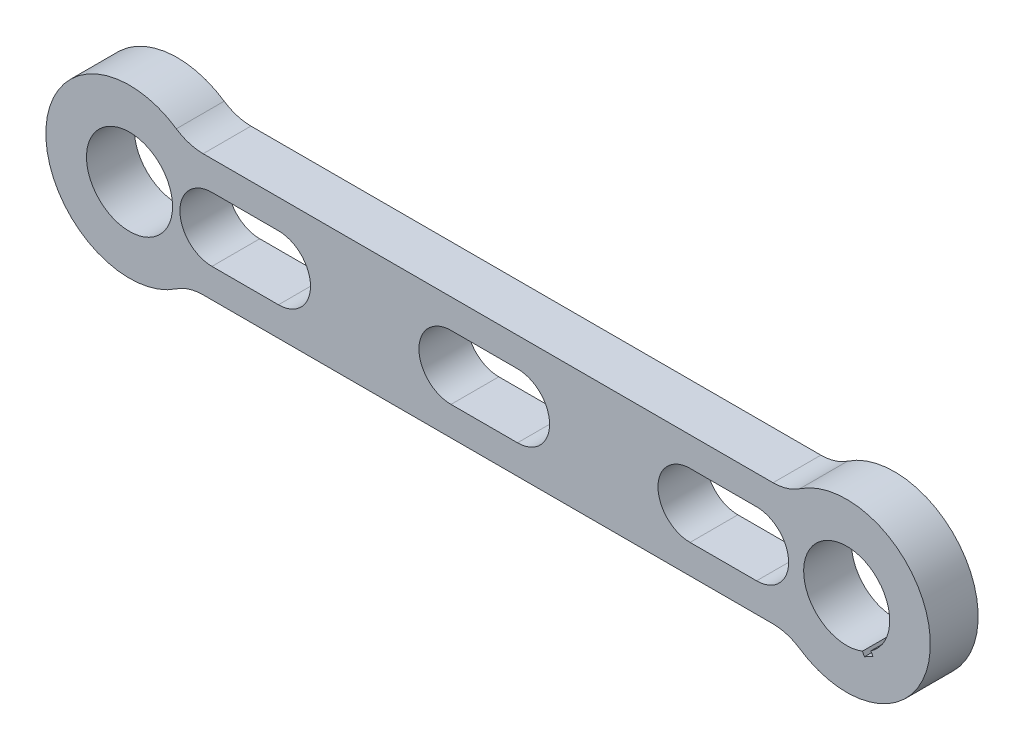
ISO-10303-21;
HEADER;
FILE_DESCRIPTION(('STEP AP214'),'2;1');
FILE_NAME('part.step','',(''),(''),'','','');
FILE_SCHEMA(('AUTOMOTIVE_DESIGN { 1 0 10303 214 1 1 1 1 }'));
ENDSEC;
DATA;
#1=APPLICATION_CONTEXT('core data for automotive mechanical design processes');
#2=APPLICATION_PROTOCOL_DEFINITION('international standard','automotive_design',2000,#1);
#3=PRODUCT_CONTEXT('',#1,'mechanical');
#4=PRODUCT('Part','Part','',(#3));
#5=PRODUCT_RELATED_PRODUCT_CATEGORY('part','',(#4));
#6=PRODUCT_DEFINITION_FORMATION('','',#4);
#7=PRODUCT_DEFINITION_CONTEXT('part definition',#1,'design');
#8=PRODUCT_DEFINITION('design','',#6,#7);
#9=PRODUCT_DEFINITION_SHAPE('','',#8);
#10=(LENGTH_UNIT() NAMED_UNIT(*) SI_UNIT(.MILLI.,.METRE.));
#11=(NAMED_UNIT(*) PLANE_ANGLE_UNIT() SI_UNIT($,.RADIAN.));
#12=(NAMED_UNIT(*) SI_UNIT($,.STERADIAN.) SOLID_ANGLE_UNIT());
#13=UNCERTAINTY_MEASURE_WITH_UNIT(LENGTH_MEASURE(1.E-05),#10,'distance_accuracy_value','');
#14=(GEOMETRIC_REPRESENTATION_CONTEXT(3) GLOBAL_UNCERTAINTY_ASSIGNED_CONTEXT((#13)) GLOBAL_UNIT_ASSIGNED_CONTEXT((#10,
#11,#12)) REPRESENTATION_CONTEXT('',''));
#15=CARTESIAN_POINT('',(0.,0.,0.));
#16=DIRECTION('',(0.,0.,1.));
#17=DIRECTION('',(1.,0.,0.));
#18=AXIS2_PLACEMENT_3D('',#15,#16,#17);
#19=CARTESIAN_POINT('',(79.3446729165543,0.,10.));
#20=DIRECTION('',(0.,0.,1.));
#21=DIRECTION('',(1.,0.,0.));
#22=AXIS2_PLACEMENT_3D('',#19,#20,#21);
#23=PLANE('',#22);
#24=DIRECTION('',(-0.467487187933383,0.883999846786264,0.));
#25=VECTOR('',#24,1.);
#26=CARTESIAN_POINT('',(84.835179051889,-8.24323458145261,10.));
#27=LINE('',#26,#25);
#28=CARTESIAN_POINT('',(84.835179051889,-8.24323458145261,10.));
#29=VERTEX_POINT('',#28);
#30=CARTESIAN_POINT('',(84.4100053103257,-7.43924779400506,10.));
#31=VERTEX_POINT('',#30);
#32=EDGE_CURVE('E226',#29,#31,#27,.T.);
#33=ORIENTED_EDGE('',*,*,#32,.F.);
#34=DIRECTION('',(0.883999846786263,0.467487187933384,0.));
#35=VECTOR('',#34,1.);
#36=CARTESIAN_POINT('',(84.835179051889,-8.24323458145261,10.));
#37=LINE('',#36,#35);
#38=CARTESIAN_POINT('',(83.0671793583165,-9.17820895731938,10.));
#39=VERTEX_POINT('',#38);
#40=EDGE_CURVE('E228',#39,#29,#37,.T.);
#41=ORIENTED_EDGE('',*,*,#40,.F.);
#42=DIRECTION('',(0.467487187933383,-0.883999846786264,0.));
#43=VECTOR('',#42,1.);
#44=CARTESIAN_POINT('',(82.6258447912271,-8.34366268576654,10.));
#45=LINE('',#44,#43);
#46=CARTESIAN_POINT('',(82.6420056197279,-8.37422217549676,10.));
#47=VERTEX_POINT('',#46);
#48=EDGE_CURVE('E207',#47,#39,#45,.T.);
#49=ORIENTED_EDGE('',*,*,#48,.F.);
#50=CARTESIAN_POINT('',(79.3446729165543,0.,10.));
#51=DIRECTION('',(0.,0.,1.));
#52=DIRECTION('',(1.,0.,0.));
#53=AXIS2_PLACEMENT_3D('',#50,#51,#52);
#54=CIRCLE('',#53,9.);
#55=EDGE_CURVE('E328',#31,#47,#54,.T.);
#56=ORIENTED_EDGE('',*,*,#55,.F.);
#57=EDGE_LOOP('',(#33,#41,#49,#56));
#58=FACE_BOUND('',#57,.T.);
#59=CARTESIAN_POINT('',(-70.6553270834457,0.,10.));
#60=DIRECTION('',(0.,0.,1.));
#61=DIRECTION('',(1.,0.,0.));
#62=AXIS2_PLACEMENT_3D('',#59,#60,#61);
#63=CIRCLE('',#62,9.);
#64=CARTESIAN_POINT('',(-61.6553270834457,0.,10.));
#65=VERTEX_POINT('',#64);
#66=EDGE_CURVE('E333',#65,#65,#63,.T.);
#67=ORIENTED_EDGE('',*,*,#66,.F.);
#68=EDGE_LOOP('',(#67));
#69=FACE_BOUND('',#68,.T.);
#70=DIRECTION('',(1.,0.,0.));
#71=VECTOR('',#70,1.);
#72=CARTESIAN_POINT('',(-58.704034485948,-12.7834504437963,10.));
#73=LINE('',#72,#71);
#74=CARTESIAN_POINT('',(-55.2551846855626,-12.7834504437963,10.));
#75=VERTEX_POINT('',#74);
#76=CARTESIAN_POINT('',(63.9445305186712,-12.7834504437963,10.));
#77=VERTEX_POINT('',#76);
#78=EDGE_CURVE('E348',#75,#77,#73,.T.);
#79=ORIENTED_EDGE('',*,*,#78,.T.);
#80=CARTESIAN_POINT('',(63.9445305186712,-22.7834504437963,10.));
#81=DIRECTION('',(0.,0.,1.));
#82=DIRECTION('',(1.,0.,0.));
#83=AXIS2_PLACEMENT_3D('',#80,#81,#82);
#84=CIRCLE('',#83,10.);
#85=CARTESIAN_POINT('',(69.5445822997196,-14.4985593733249,10.));
#86=VERTEX_POINT('',#85);
#87=EDGE_CURVE('E385',#77,#86,#84,.F.);
#88=ORIENTED_EDGE('',*,*,#87,.T.);
#89=CARTESIAN_POINT('',(79.3446729165543,0.,10.));
#90=DIRECTION('',(0.,0.,1.));
#91=DIRECTION('',(1.,0.,0.));
#92=AXIS2_PLACEMENT_3D('',#89,#90,#91);
#93=CIRCLE('',#92,17.5);
#94=CARTESIAN_POINT('',(69.5445822997196,14.4985593733249,10.));
#95=VERTEX_POINT('',#94);
#96=EDGE_CURVE('E339',#86,#95,#93,.T.);
#97=ORIENTED_EDGE('',*,*,#96,.T.);
#98=CARTESIAN_POINT('',(63.9445305186712,22.7834504437963,10.));
#99=DIRECTION('',(0.,0.,1.));
#100=DIRECTION('',(1.,0.,0.));
#101=AXIS2_PLACEMENT_3D('',#98,#99,#100);
#102=CIRCLE('',#101,10.);
#103=CARTESIAN_POINT('',(63.9445305186712,12.7834504437963,10.));
#104=VERTEX_POINT('',#103);
#105=EDGE_CURVE('E381',#95,#104,#102,.F.);
#106=ORIENTED_EDGE('',*,*,#105,.T.);
#107=DIRECTION('',(-1.,0.,0.));
#108=VECTOR('',#107,1.);
#109=CARTESIAN_POINT('',(-58.704034485948,12.7834504437963,10.));
#110=LINE('',#109,#108);
#111=CARTESIAN_POINT('',(-55.2551846855626,12.7834504437963,10.));
#112=VERTEX_POINT('',#111);
#113=EDGE_CURVE('E342',#104,#112,#110,.T.);
#114=ORIENTED_EDGE('',*,*,#113,.T.);
#115=CARTESIAN_POINT('',(-55.2551846855626,22.7834504437963,10.));
#116=DIRECTION('',(0.,0.,1.));
#117=DIRECTION('',(1.,0.,0.));
#118=AXIS2_PLACEMENT_3D('',#115,#116,#117);
#119=CIRCLE('',#118,10.);
#120=CARTESIAN_POINT('',(-60.855236466611,14.4985593733249,10.));
#121=VERTEX_POINT('',#120);
#122=EDGE_CURVE('E393',#112,#121,#119,.F.);
#123=ORIENTED_EDGE('',*,*,#122,.T.);
#124=CARTESIAN_POINT('',(-70.6553270834457,0.,10.));
#125=DIRECTION('',(0.,0.,1.));
#126=DIRECTION('',(1.,0.,0.));
#127=AXIS2_PLACEMENT_3D('',#124,#125,#126);
#128=CIRCLE('',#127,17.5);
#129=CARTESIAN_POINT('',(-60.855236466611,-14.4985593733249,10.));
#130=VERTEX_POINT('',#129);
#131=EDGE_CURVE('E346',#121,#130,#128,.T.);
#132=ORIENTED_EDGE('',*,*,#131,.T.);
#133=CARTESIAN_POINT('',(-55.2551846855626,-22.7834504437963,10.));
#134=DIRECTION('',(0.,0.,1.));
#135=DIRECTION('',(1.,0.,0.));
#136=AXIS2_PLACEMENT_3D('',#133,#134,#135);
#137=CIRCLE('',#136,10.);
#138=EDGE_CURVE('E389',#130,#75,#137,.F.);
#139=ORIENTED_EDGE('',*,*,#138,.T.);
#140=EDGE_LOOP('',(#79,#88,#97,#106,#114,#123,#132,#139));
#141=FACE_BOUND('',#140,.T.);
#142=DIRECTION('',(1.,0.,0.));
#143=VECTOR('',#142,1.);
#144=CARTESIAN_POINT('',(-53.4129788387876,-6.70241567098039,10.));
#145=LINE('',#144,#143);
#146=CARTESIAN_POINT('',(-53.4129788387876,-6.70241567098039,10.));
#147=VERTEX_POINT('',#146);
#148=CARTESIAN_POINT('',(-39.5013970371676,-6.70241567098039,10.));
#149=VERTEX_POINT('',#148);
#150=EDGE_CURVE('E300',#147,#149,#145,.T.);
#151=ORIENTED_EDGE('',*,*,#150,.F.);
#152=CARTESIAN_POINT('',(-53.4129788387876,0.,10.));
#153=DIRECTION('',(0.,0.,1.));
#154=DIRECTION('',(1.,0.,0.));
#155=AXIS2_PLACEMENT_3D('',#152,#153,#154);
#156=CIRCLE('',#155,6.70241567098039);
#157=CARTESIAN_POINT('',(-53.4129788387876,6.70241567098039,10.));
#158=VERTEX_POINT('',#157);
#159=EDGE_CURVE('E298',#158,#147,#156,.T.);
#160=ORIENTED_EDGE('',*,*,#159,.F.);
#161=DIRECTION('',(-1.,0.,0.));
#162=VECTOR('',#161,1.);
#163=CARTESIAN_POINT('',(-53.4129788387876,6.70241567098039,10.));
#164=LINE('',#163,#162);
#165=CARTESIAN_POINT('',(-39.5013970371676,6.70241567098039,10.));
#166=VERTEX_POINT('',#165);
#167=EDGE_CURVE('E306',#166,#158,#164,.T.);
#168=ORIENTED_EDGE('',*,*,#167,.F.);
#169=CARTESIAN_POINT('',(-39.5013970371676,0.,10.));
#170=DIRECTION('',(0.,0.,1.));
#171=DIRECTION('',(1.,0.,0.));
#172=AXIS2_PLACEMENT_3D('',#169,#170,#171);
#173=CIRCLE('',#172,6.70241567098039);
#174=EDGE_CURVE('E303',#149,#166,#173,.T.);
#175=ORIENTED_EDGE('',*,*,#174,.F.);
#176=EDGE_LOOP('',(#151,#160,#168,#175));
#177=FACE_BOUND('',#176,.T.);
#178=DIRECTION('',(1.,0.,0.));
#179=VECTOR('',#178,1.);
#180=CARTESIAN_POINT('',(-3.41297883878763,-6.7024156709804,10.));
#181=LINE('',#180,#179);
#182=CARTESIAN_POINT('',(-3.41297883878763,-6.7024156709804,10.));
#183=VERTEX_POINT('',#182);
#184=CARTESIAN_POINT('',(10.4986029628324,-6.7024156709804,10.));
#185=VERTEX_POINT('',#184);
#186=EDGE_CURVE('E269',#183,#185,#181,.T.);
#187=ORIENTED_EDGE('',*,*,#186,.F.);
#188=CARTESIAN_POINT('',(-3.41297883878763,0.,10.));
#189=DIRECTION('',(0.,0.,1.));
#190=DIRECTION('',(1.,0.,0.));
#191=AXIS2_PLACEMENT_3D('',#188,#189,#190);
#192=CIRCLE('',#191,6.7024156709804);
#193=CARTESIAN_POINT('',(-3.41297883878763,6.7024156709804,10.));
#194=VERTEX_POINT('',#193);
#195=EDGE_CURVE('E267',#194,#183,#192,.T.);
#196=ORIENTED_EDGE('',*,*,#195,.F.);
#197=DIRECTION('',(-1.,0.,0.));
#198=VECTOR('',#197,1.);
#199=CARTESIAN_POINT('',(-3.41297883878763,6.7024156709804,10.));
#200=LINE('',#199,#198);
#201=CARTESIAN_POINT('',(10.4986029628324,6.7024156709804,10.));
#202=VERTEX_POINT('',#201);
#203=EDGE_CURVE('E275',#202,#194,#200,.T.);
#204=ORIENTED_EDGE('',*,*,#203,.F.);
#205=CARTESIAN_POINT('',(10.4986029628324,0.,10.));
#206=DIRECTION('',(0.,0.,1.));
#207=DIRECTION('',(1.,0.,0.));
#208=AXIS2_PLACEMENT_3D('',#205,#206,#207);
#209=CIRCLE('',#208,6.7024156709804);
#210=EDGE_CURVE('E272',#185,#202,#209,.T.);
#211=ORIENTED_EDGE('',*,*,#210,.F.);
#212=EDGE_LOOP('',(#187,#196,#204,#211));
#213=FACE_BOUND('',#212,.T.);
#214=DIRECTION('',(1.,0.,0.));
#215=VECTOR('',#214,1.);
#216=CARTESIAN_POINT('',(46.5870211612124,-6.7024156709804,10.));
#217=LINE('',#216,#215);
#218=CARTESIAN_POINT('',(46.5870211612124,-6.7024156709804,10.));
#219=VERTEX_POINT('',#218);
#220=CARTESIAN_POINT('',(60.4986029628324,-6.7024156709804,10.));
#221=VERTEX_POINT('',#220);
#222=EDGE_CURVE('E238',#219,#221,#217,.T.);
#223=ORIENTED_EDGE('',*,*,#222,.F.);
#224=CARTESIAN_POINT('',(46.5870211612124,0.,10.));
#225=DIRECTION('',(0.,0.,1.));
#226=DIRECTION('',(1.,0.,0.));
#227=AXIS2_PLACEMENT_3D('',#224,#225,#226);
#228=CIRCLE('',#227,6.7024156709804);
#229=CARTESIAN_POINT('',(46.5870211612124,6.7024156709804,10.));
#230=VERTEX_POINT('',#229);
#231=EDGE_CURVE('E236',#230,#219,#228,.T.);
#232=ORIENTED_EDGE('',*,*,#231,.F.);
#233=DIRECTION('',(-1.,0.,0.));
#234=VECTOR('',#233,1.);
#235=CARTESIAN_POINT('',(46.5870211612124,6.7024156709804,10.));
#236=LINE('',#235,#234);
#237=CARTESIAN_POINT('',(60.4986029628324,6.7024156709804,10.));
#238=VERTEX_POINT('',#237);
#239=EDGE_CURVE('E244',#238,#230,#236,.T.);
#240=ORIENTED_EDGE('',*,*,#239,.F.);
#241=CARTESIAN_POINT('',(60.4986029628324,0.,10.));
#242=DIRECTION('',(0.,0.,1.));
#243=DIRECTION('',(1.,0.,0.));
#244=AXIS2_PLACEMENT_3D('',#241,#242,#243);
#245=CIRCLE('',#244,6.7024156709804);
#246=EDGE_CURVE('E241',#221,#238,#245,.T.);
#247=ORIENTED_EDGE('',*,*,#246,.F.);
#248=EDGE_LOOP('',(#223,#232,#240,#247));
#249=FACE_BOUND('',#248,.T.);
#250=ADVANCED_FACE('F43',(#58,#69,#141,#177,#213,#249),#23,.T.);
#251=CARTESIAN_POINT('',(79.3446729165543,0.,0.));
#252=DIRECTION('',(0.,0.,1.));
#253=DIRECTION('',(1.,0.,0.));
#254=AXIS2_PLACEMENT_3D('',#251,#252,#253);
#255=PLANE('',#254);
#256=CARTESIAN_POINT('',(-3.41297883878763,0.,0.));
#257=DIRECTION('',(0.,0.,1.));
#258=DIRECTION('',(1.,0.,0.));
#259=AXIS2_PLACEMENT_3D('',#256,#257,#258);
#260=CIRCLE('',#259,6.7024156709804);
#261=CARTESIAN_POINT('',(-3.41297883878762,6.7024156709804,0.));
#262=VERTEX_POINT('',#261);
#263=CARTESIAN_POINT('',(-3.41297883878763,-6.7024156709804,0.));
#264=VERTEX_POINT('',#263);
#265=EDGE_CURVE('E266',#262,#264,#260,.T.);
#266=ORIENTED_EDGE('',*,*,#265,.T.);
#267=DIRECTION('',(1.,0.,0.));
#268=VECTOR('',#267,1.);
#269=CARTESIAN_POINT('',(-3.41297883878763,-6.7024156709804,0.));
#270=LINE('',#269,#268);
#271=CARTESIAN_POINT('',(10.4986029628324,-6.7024156709804,0.));
#272=VERTEX_POINT('',#271);
#273=EDGE_CURVE('E280',#264,#272,#270,.T.);
#274=ORIENTED_EDGE('',*,*,#273,.T.);
#275=CARTESIAN_POINT('',(10.4986029628324,0.,0.));
#276=DIRECTION('',(0.,0.,1.));
#277=DIRECTION('',(1.,0.,0.));
#278=AXIS2_PLACEMENT_3D('',#275,#276,#277);
#279=CIRCLE('',#278,6.7024156709804);
#280=CARTESIAN_POINT('',(10.4986029628324,6.7024156709804,0.));
#281=VERTEX_POINT('',#280);
#282=EDGE_CURVE('E283',#272,#281,#279,.T.);
#283=ORIENTED_EDGE('',*,*,#282,.T.);
#284=DIRECTION('',(-1.,0.,0.));
#285=VECTOR('',#284,1.);
#286=CARTESIAN_POINT('',(-3.41297883878763,6.7024156709804,0.));
#287=LINE('',#286,#285);
#288=EDGE_CURVE('E270',#281,#262,#287,.T.);
#289=ORIENTED_EDGE('',*,*,#288,.T.);
#290=EDGE_LOOP('',(#266,#274,#283,#289));
#291=FACE_BOUND('',#290,.T.);
#292=DIRECTION('',(0.883999846786263,0.467487187933384,0.));
#293=VECTOR('',#292,1.);
#294=CARTESIAN_POINT('',(84.835179051889,-8.24323458145261,0.));
#295=LINE('',#294,#293);
#296=CARTESIAN_POINT('',(83.0671793583165,-9.17820895731938,0.));
#297=VERTEX_POINT('',#296);
#298=CARTESIAN_POINT('',(84.835179051889,-8.24323458145261,0.));
#299=VERTEX_POINT('',#298);
#300=EDGE_CURVE('E215',#297,#299,#295,.T.);
#301=ORIENTED_EDGE('',*,*,#300,.T.);
#302=DIRECTION('',(-0.467487187933383,0.883999846786264,0.));
#303=VECTOR('',#302,1.);
#304=CARTESIAN_POINT('',(84.835179051889,-8.24323458145261,0.));
#305=LINE('',#304,#303);
#306=CARTESIAN_POINT('',(84.4100053103257,-7.43924779400506,0.));
#307=VERTEX_POINT('',#306);
#308=EDGE_CURVE('E212',#299,#307,#305,.T.);
#309=ORIENTED_EDGE('',*,*,#308,.T.);
#310=CARTESIAN_POINT('',(79.3446729165543,0.,0.));
#311=DIRECTION('',(0.,0.,1.));
#312=DIRECTION('',(1.,0.,0.));
#313=AXIS2_PLACEMENT_3D('',#310,#311,#312);
#314=CIRCLE('',#313,9.);
#315=CARTESIAN_POINT('',(82.6420056197279,-8.37422217549677,0.));
#316=VERTEX_POINT('',#315);
#317=EDGE_CURVE('E225',#307,#316,#314,.T.);
#318=ORIENTED_EDGE('',*,*,#317,.T.);
#319=DIRECTION('',(0.467487187933383,-0.883999846786264,0.));
#320=VECTOR('',#319,1.);
#321=CARTESIAN_POINT('',(82.6258447912271,-8.34366268576654,0.));
#322=LINE('',#321,#320);
#323=EDGE_CURVE('E58',#316,#297,#322,.T.);
#324=ORIENTED_EDGE('',*,*,#323,.T.);
#325=EDGE_LOOP('',(#301,#309,#318,#324));
#326=FACE_BOUND('',#325,.T.);
#327=CARTESIAN_POINT('',(-70.6553270834457,0.,0.));
#328=DIRECTION('',(0.,0.,1.));
#329=DIRECTION('',(1.,0.,0.));
#330=AXIS2_PLACEMENT_3D('',#327,#328,#329);
#331=CIRCLE('',#330,9.);
#332=CARTESIAN_POINT('',(-61.6553270834457,0.,0.));
#333=VERTEX_POINT('',#332);
#334=EDGE_CURVE('E331',#333,#333,#331,.T.);
#335=ORIENTED_EDGE('',*,*,#334,.T.);
#336=EDGE_LOOP('',(#335));
#337=FACE_BOUND('',#336,.T.);
#338=CARTESIAN_POINT('',(79.3446729165543,0.,0.));
#339=DIRECTION('',(0.,0.,1.));
#340=DIRECTION('',(1.,0.,0.));
#341=AXIS2_PLACEMENT_3D('',#338,#339,#340);
#342=CIRCLE('',#341,17.5);
#343=CARTESIAN_POINT('',(69.5445822997196,-14.4985593733249,0.));
#344=VERTEX_POINT('',#343);
#345=CARTESIAN_POINT('',(69.5445822997196,14.4985593733249,0.));
#346=VERTEX_POINT('',#345);
#347=EDGE_CURVE('E336',#344,#346,#342,.T.);
#348=ORIENTED_EDGE('',*,*,#347,.F.);
#349=CARTESIAN_POINT('',(63.9445305186712,-22.7834504437963,0.));
#350=DIRECTION('',(0.,0.,1.));
#351=DIRECTION('',(1.,0.,0.));
#352=AXIS2_PLACEMENT_3D('',#349,#350,#351);
#353=CIRCLE('',#352,10.);
#354=CARTESIAN_POINT('',(63.9445305186712,-12.7834504437963,0.));
#355=VERTEX_POINT('',#354);
#356=EDGE_CURVE('E383',#344,#355,#353,.T.);
#357=ORIENTED_EDGE('',*,*,#356,.T.);
#358=DIRECTION('',(1.,0.,0.));
#359=VECTOR('',#358,1.);
#360=CARTESIAN_POINT('',(-58.704034485948,-12.7834504437963,0.));
#361=LINE('',#360,#359);
#362=CARTESIAN_POINT('',(-55.2551846855626,-12.7834504437963,0.));
#363=VERTEX_POINT('',#362);
#364=EDGE_CURVE('E343',#363,#355,#361,.T.);
#365=ORIENTED_EDGE('',*,*,#364,.F.);
#366=CARTESIAN_POINT('',(-55.2551846855626,-22.7834504437963,0.));
#367=DIRECTION('',(0.,0.,1.));
#368=DIRECTION('',(1.,0.,0.));
#369=AXIS2_PLACEMENT_3D('',#366,#367,#368);
#370=CIRCLE('',#369,10.);
#371=CARTESIAN_POINT('',(-60.855236466611,-14.4985593733249,0.));
#372=VERTEX_POINT('',#371);
#373=EDGE_CURVE('E387',#363,#372,#370,.T.);
#374=ORIENTED_EDGE('',*,*,#373,.T.);
#375=CARTESIAN_POINT('',(-70.6553270834457,0.,0.));
#376=DIRECTION('',(0.,0.,1.));
#377=DIRECTION('',(1.,0.,0.));
#378=AXIS2_PLACEMENT_3D('',#375,#376,#377);
#379=CIRCLE('',#378,17.5);
#380=CARTESIAN_POINT('',(-60.855236466611,14.4985593733249,0.));
#381=VERTEX_POINT('',#380);
#382=EDGE_CURVE('E357',#381,#372,#379,.T.);
#383=ORIENTED_EDGE('',*,*,#382,.F.);
#384=CARTESIAN_POINT('',(-55.2551846855626,22.7834504437963,0.));
#385=DIRECTION('',(0.,0.,1.));
#386=DIRECTION('',(1.,0.,0.));
#387=AXIS2_PLACEMENT_3D('',#384,#385,#386);
#388=CIRCLE('',#387,10.);
#389=CARTESIAN_POINT('',(-55.2551846855626,12.7834504437963,0.));
#390=VERTEX_POINT('',#389);
#391=EDGE_CURVE('E391',#381,#390,#388,.T.);
#392=ORIENTED_EDGE('',*,*,#391,.T.);
#393=DIRECTION('',(-1.,0.,0.));
#394=VECTOR('',#393,1.);
#395=CARTESIAN_POINT('',(-58.704034485948,12.7834504437963,0.));
#396=LINE('',#395,#394);
#397=CARTESIAN_POINT('',(63.9445305186712,12.7834504437963,0.));
#398=VERTEX_POINT('',#397);
#399=EDGE_CURVE('E354',#398,#390,#396,.T.);
#400=ORIENTED_EDGE('',*,*,#399,.F.);
#401=CARTESIAN_POINT('',(63.9445305186712,22.7834504437963,0.));
#402=DIRECTION('',(0.,0.,1.));
#403=DIRECTION('',(1.,0.,0.));
#404=AXIS2_PLACEMENT_3D('',#401,#402,#403);
#405=CIRCLE('',#404,10.);
#406=EDGE_CURVE('E379',#398,#346,#405,.T.);
#407=ORIENTED_EDGE('',*,*,#406,.T.);
#408=EDGE_LOOP('',(#348,#357,#365,#374,#383,#392,#400,#407));
#409=FACE_BOUND('',#408,.T.);
#410=CARTESIAN_POINT('',(-53.4129788387876,0.,0.));
#411=DIRECTION('',(0.,0.,1.));
#412=DIRECTION('',(1.,0.,0.));
#413=AXIS2_PLACEMENT_3D('',#410,#411,#412);
#414=CIRCLE('',#413,6.70241567098039);
#415=CARTESIAN_POINT('',(-53.4129788387876,6.70241567098039,0.));
#416=VERTEX_POINT('',#415);
#417=CARTESIAN_POINT('',(-53.4129788387876,-6.70241567098039,0.));
#418=VERTEX_POINT('',#417);
#419=EDGE_CURVE('E297',#416,#418,#414,.T.);
#420=ORIENTED_EDGE('',*,*,#419,.T.);
#421=DIRECTION('',(1.,0.,0.));
#422=VECTOR('',#421,1.);
#423=CARTESIAN_POINT('',(-53.4129788387876,-6.70241567098039,0.));
#424=LINE('',#423,#422);
#425=CARTESIAN_POINT('',(-39.5013970371676,-6.70241567098039,0.));
#426=VERTEX_POINT('',#425);
#427=EDGE_CURVE('E311',#418,#426,#424,.T.);
#428=ORIENTED_EDGE('',*,*,#427,.T.);
#429=CARTESIAN_POINT('',(-39.5013970371676,0.,0.));
#430=DIRECTION('',(0.,0.,1.));
#431=DIRECTION('',(1.,0.,0.));
#432=AXIS2_PLACEMENT_3D('',#429,#430,#431);
#433=CIRCLE('',#432,6.70241567098039);
#434=CARTESIAN_POINT('',(-39.5013970371676,6.70241567098039,0.));
#435=VERTEX_POINT('',#434);
#436=EDGE_CURVE('E314',#426,#435,#433,.T.);
#437=ORIENTED_EDGE('',*,*,#436,.T.);
#438=DIRECTION('',(-1.,0.,0.));
#439=VECTOR('',#438,1.);
#440=CARTESIAN_POINT('',(-53.4129788387876,6.70241567098039,0.));
#441=LINE('',#440,#439);
#442=EDGE_CURVE('E301',#435,#416,#441,.T.);
#443=ORIENTED_EDGE('',*,*,#442,.T.);
#444=EDGE_LOOP('',(#420,#428,#437,#443));
#445=FACE_BOUND('',#444,.T.);
#446=CARTESIAN_POINT('',(46.5870211612124,0.,0.));
#447=DIRECTION('',(0.,0.,1.));
#448=DIRECTION('',(1.,0.,0.));
#449=AXIS2_PLACEMENT_3D('',#446,#447,#448);
#450=CIRCLE('',#449,6.7024156709804);
#451=CARTESIAN_POINT('',(46.5870211612124,6.7024156709804,0.));
#452=VERTEX_POINT('',#451);
#453=CARTESIAN_POINT('',(46.5870211612124,-6.7024156709804,0.));
#454=VERTEX_POINT('',#453);
#455=EDGE_CURVE('E234',#452,#454,#450,.T.);
#456=ORIENTED_EDGE('',*,*,#455,.T.);
#457=DIRECTION('',(1.,0.,0.));
#458=VECTOR('',#457,1.);
#459=CARTESIAN_POINT('',(46.5870211612124,-6.7024156709804,0.));
#460=LINE('',#459,#458);
#461=CARTESIAN_POINT('',(60.4986029628324,-6.7024156709804,0.));
#462=VERTEX_POINT('',#461);
#463=EDGE_CURVE('E249',#454,#462,#460,.T.);
#464=ORIENTED_EDGE('',*,*,#463,.T.);
#465=CARTESIAN_POINT('',(60.4986029628324,0.,0.));
#466=DIRECTION('',(0.,0.,1.));
#467=DIRECTION('',(1.,0.,0.));
#468=AXIS2_PLACEMENT_3D('',#465,#466,#467);
#469=CIRCLE('',#468,6.7024156709804);
#470=CARTESIAN_POINT('',(60.4986029628324,6.7024156709804,0.));
#471=VERTEX_POINT('',#470);
#472=EDGE_CURVE('E252',#462,#471,#469,.T.);
#473=ORIENTED_EDGE('',*,*,#472,.T.);
#474=DIRECTION('',(-1.,0.,0.));
#475=VECTOR('',#474,1.);
#476=CARTESIAN_POINT('',(46.5870211612124,6.7024156709804,0.));
#477=LINE('',#476,#475);
#478=EDGE_CURVE('E239',#471,#452,#477,.T.);
#479=ORIENTED_EDGE('',*,*,#478,.T.);
#480=EDGE_LOOP('',(#456,#464,#473,#479));
#481=FACE_BOUND('',#480,.T.);
#482=ADVANCED_FACE('F222',(#291,#326,#337,#409,#445,#481),#255,.F.);
#483=CARTESIAN_POINT('',(79.3446729165543,0.,10.));
#484=DIRECTION('',(0.,0.,-1.));
#485=DIRECTION('',(-1.,0.,0.));
#486=AXIS2_PLACEMENT_3D('',#483,#484,#485);
#487=CYLINDRICAL_SURFACE('',#486,17.5);
#488=ORIENTED_EDGE('',*,*,#347,.T.);
#489=DIRECTION('',(0.,0.,-1.));
#490=VECTOR('',#489,1.);
#491=CARTESIAN_POINT('',(69.5445822997196,14.4985593733249,10.));
#492=LINE('',#491,#490);
#493=EDGE_CURVE('E368',#346,#95,#492,.F.);
#494=ORIENTED_EDGE('',*,*,#493,.T.);
#495=ORIENTED_EDGE('',*,*,#96,.F.);
#496=DIRECTION('',(0.,0.,-1.));
#497=VECTOR('',#496,1.);
#498=CARTESIAN_POINT('',(69.5445822997196,-14.4985593733249,10.));
#499=LINE('',#498,#497);
#500=EDGE_CURVE('E365',#86,#344,#499,.T.);
#501=ORIENTED_EDGE('',*,*,#500,.T.);
#502=EDGE_LOOP('',(#488,#494,#495,#501));
#503=FACE_BOUND('',#502,.T.);
#504=ADVANCED_FACE('F418',(#503),#487,.T.);
#505=CARTESIAN_POINT('',(-58.704034485948,12.7834504437963,10.));
#506=DIRECTION('',(0.,-1.,0.));
#507=DIRECTION('',(0.,0.,-1.));
#508=AXIS2_PLACEMENT_3D('',#505,#506,#507);
#509=PLANE('',#508);
#510=ORIENTED_EDGE('',*,*,#113,.F.);
#511=DIRECTION('',(0.,0.,1.));
#512=VECTOR('',#511,1.);
#513=CARTESIAN_POINT('',(63.9445305186712,12.7834504437963,0.));
#514=LINE('',#513,#512);
#515=EDGE_CURVE('E362',#104,#398,#514,.F.);
#516=ORIENTED_EDGE('',*,*,#515,.T.);
#517=ORIENTED_EDGE('',*,*,#399,.T.);
#518=DIRECTION('',(0.,0.,1.));
#519=VECTOR('',#518,1.);
#520=CARTESIAN_POINT('',(-55.2551846855626,12.7834504437963,10.));
#521=LINE('',#520,#519);
#522=EDGE_CURVE('E351',#390,#112,#521,.T.);
#523=ORIENTED_EDGE('',*,*,#522,.T.);
#524=EDGE_LOOP('',(#510,#516,#517,#523));
#525=FACE_BOUND('',#524,.T.);
#526=ADVANCED_FACE('F432',(#525),#509,.F.);
#527=CARTESIAN_POINT('',(-70.6553270834457,0.,10.));
#528=DIRECTION('',(0.,0.,-1.));
#529=DIRECTION('',(-1.,0.,0.));
#530=AXIS2_PLACEMENT_3D('',#527,#528,#529);
#531=CYLINDRICAL_SURFACE('',#530,17.5);
#532=ORIENTED_EDGE('',*,*,#382,.T.);
#533=DIRECTION('',(0.,0.,-1.));
#534=VECTOR('',#533,1.);
#535=CARTESIAN_POINT('',(-60.855236466611,-14.4985593733249,10.));
#536=LINE('',#535,#534);
#537=EDGE_CURVE('E66',#372,#130,#536,.F.);
#538=ORIENTED_EDGE('',*,*,#537,.T.);
#539=ORIENTED_EDGE('',*,*,#131,.F.);
#540=DIRECTION('',(0.,0.,-1.));
#541=VECTOR('',#540,1.);
#542=CARTESIAN_POINT('',(-60.855236466611,14.4985593733249,10.));
#543=LINE('',#542,#541);
#544=EDGE_CURVE('E375',#121,#381,#543,.T.);
#545=ORIENTED_EDGE('',*,*,#544,.T.);
#546=EDGE_LOOP('',(#532,#538,#539,#545));
#547=FACE_BOUND('',#546,.T.);
#548=ADVANCED_FACE('F428',(#547),#531,.T.);
#549=CARTESIAN_POINT('',(-58.704034485948,-12.7834504437963,10.));
#550=DIRECTION('',(0.,1.,0.));
#551=DIRECTION('',(0.,0.,1.));
#552=AXIS2_PLACEMENT_3D('',#549,#550,#551);
#553=PLANE('',#552);
#554=ORIENTED_EDGE('',*,*,#364,.T.);
#555=DIRECTION('',(0.,0.,1.));
#556=VECTOR('',#555,1.);
#557=CARTESIAN_POINT('',(63.9445305186712,-12.7834504437963,10.));
#558=LINE('',#557,#556);
#559=EDGE_CURVE('E373',#355,#77,#558,.T.);
#560=ORIENTED_EDGE('',*,*,#559,.T.);
#561=ORIENTED_EDGE('',*,*,#78,.F.);
#562=DIRECTION('',(0.,0.,1.));
#563=VECTOR('',#562,1.);
#564=CARTESIAN_POINT('',(-55.2551846855626,-12.7834504437963,0.));
#565=LINE('',#564,#563);
#566=EDGE_CURVE('E370',#75,#363,#565,.F.);
#567=ORIENTED_EDGE('',*,*,#566,.T.);
#568=EDGE_LOOP('',(#554,#560,#561,#567));
#569=FACE_BOUND('',#568,.T.);
#570=ADVANCED_FACE('F425',(#569),#553,.F.);
#571=CARTESIAN_POINT('',(-70.6553270834457,0.,10.));
#572=DIRECTION('',(0.,0.,-1.));
#573=DIRECTION('',(-1.,0.,0.));
#574=AXIS2_PLACEMENT_3D('',#571,#572,#573);
#575=CYLINDRICAL_SURFACE('',#574,9.);
#576=ORIENTED_EDGE('',*,*,#66,.T.);
#577=EDGE_LOOP('',(#576));
#578=FACE_BOUND('',#577,.T.);
#579=ORIENTED_EDGE('',*,*,#334,.F.);
#580=EDGE_LOOP('',(#579));
#581=FACE_BOUND('',#580,.T.);
#582=ADVANCED_FACE('F422',(#578,#581),#575,.F.);
#583=CARTESIAN_POINT('',(79.3446729165543,0.,10.));
#584=DIRECTION('',(0.,0.,-1.));
#585=DIRECTION('',(-1.,0.,0.));
#586=AXIS2_PLACEMENT_3D('',#583,#584,#585);
#587=CYLINDRICAL_SURFACE('',#586,9.);
#588=DIRECTION('',(0.,0.,-1.));
#589=VECTOR('',#588,1.);
#590=CARTESIAN_POINT('',(84.4100053103257,-7.43924779400506,10.));
#591=LINE('',#590,#589);
#592=EDGE_CURVE('E11',#31,#307,#591,.T.);
#593=ORIENTED_EDGE('',*,*,#592,.F.);
#594=ORIENTED_EDGE('',*,*,#55,.T.);
#595=DIRECTION('',(0.,0.,-1.));
#596=VECTOR('',#595,1.);
#597=CARTESIAN_POINT('',(82.6420056197279,-8.37422217549676,10.));
#598=LINE('',#597,#596);
#599=EDGE_CURVE('E51',#316,#47,#598,.F.);
#600=ORIENTED_EDGE('',*,*,#599,.F.);
#601=ORIENTED_EDGE('',*,*,#317,.F.);
#602=EDGE_LOOP('',(#593,#594,#600,#601));
#603=FACE_BOUND('',#602,.T.);
#604=ADVANCED_FACE('F400',(#603),#587,.F.);
#605=CARTESIAN_POINT('',(-53.4129788387876,0.,10.));
#606=DIRECTION('',(0.,0.,-1.));
#607=DIRECTION('',(-1.,0.,0.));
#608=AXIS2_PLACEMENT_3D('',#605,#606,#607);
#609=CYLINDRICAL_SURFACE('',#608,6.70241567098039);
#610=ORIENTED_EDGE('',*,*,#419,.F.);
#611=DIRECTION('',(0.,0.,-1.));
#612=VECTOR('',#611,1.);
#613=CARTESIAN_POINT('',(-53.4129788387876,6.70241567098039,10.));
#614=LINE('',#613,#612);
#615=EDGE_CURVE('E308',#158,#416,#614,.T.);
#616=ORIENTED_EDGE('',*,*,#615,.F.);
#617=ORIENTED_EDGE('',*,*,#159,.T.);
#618=DIRECTION('',(0.,0.,-1.));
#619=VECTOR('',#618,1.);
#620=CARTESIAN_POINT('',(-53.4129788387876,-6.70241567098039,10.));
#621=LINE('',#620,#619);
#622=EDGE_CURVE('E325',#147,#418,#621,.T.);
#623=ORIENTED_EDGE('',*,*,#622,.T.);
#624=EDGE_LOOP('',(#610,#616,#617,#623));
#625=FACE_BOUND('',#624,.T.);
#626=ADVANCED_FACE('F530',(#625),#609,.F.);
#627=CARTESIAN_POINT('',(-53.4129788387876,-6.70241567098039,10.));
#628=DIRECTION('',(0.,1.,0.));
#629=DIRECTION('',(0.,0.,1.));
#630=AXIS2_PLACEMENT_3D('',#627,#628,#629);
#631=PLANE('',#630);
#632=ORIENTED_EDGE('',*,*,#427,.F.);
#633=ORIENTED_EDGE('',*,*,#622,.F.);
#634=ORIENTED_EDGE('',*,*,#150,.T.);
#635=DIRECTION('',(0.,0.,-1.));
#636=VECTOR('',#635,1.);
#637=CARTESIAN_POINT('',(-39.5013970371676,-6.70241567098039,10.));
#638=LINE('',#637,#636);
#639=EDGE_CURVE('E323',#149,#426,#638,.T.);
#640=ORIENTED_EDGE('',*,*,#639,.T.);
#641=EDGE_LOOP('',(#632,#633,#634,#640));
#642=FACE_BOUND('',#641,.T.);
#643=ADVANCED_FACE('F526',(#642),#631,.T.);
#644=CARTESIAN_POINT('',(-39.5013970371676,0.,10.));
#645=DIRECTION('',(0.,0.,-1.));
#646=DIRECTION('',(-1.,0.,0.));
#647=AXIS2_PLACEMENT_3D('',#644,#645,#646);
#648=CYLINDRICAL_SURFACE('',#647,6.70241567098039);
#649=ORIENTED_EDGE('',*,*,#436,.F.);
#650=ORIENTED_EDGE('',*,*,#639,.F.);
#651=ORIENTED_EDGE('',*,*,#174,.T.);
#652=DIRECTION('',(0.,0.,-1.));
#653=VECTOR('',#652,1.);
#654=CARTESIAN_POINT('',(-39.5013970371676,6.70241567098039,10.));
#655=LINE('',#654,#653);
#656=EDGE_CURVE('E321',#166,#435,#655,.T.);
#657=ORIENTED_EDGE('',*,*,#656,.T.);
#658=EDGE_LOOP('',(#649,#650,#651,#657));
#659=FACE_BOUND('',#658,.T.);
#660=ADVANCED_FACE('F522',(#659),#648,.F.);
#661=CARTESIAN_POINT('',(-53.4129788387876,6.70241567098039,10.));
#662=DIRECTION('',(0.,-1.,0.));
#663=DIRECTION('',(0.,0.,-1.));
#664=AXIS2_PLACEMENT_3D('',#661,#662,#663);
#665=PLANE('',#664);
#666=ORIENTED_EDGE('',*,*,#442,.F.);
#667=ORIENTED_EDGE('',*,*,#656,.F.);
#668=ORIENTED_EDGE('',*,*,#167,.T.);
#669=ORIENTED_EDGE('',*,*,#615,.T.);
#670=EDGE_LOOP('',(#666,#667,#668,#669));
#671=FACE_BOUND('',#670,.T.);
#672=ADVANCED_FACE('F518',(#671),#665,.T.);
#673=CARTESIAN_POINT('',(-3.41297883878763,0.,10.));
#674=DIRECTION('',(0.,0.,-1.));
#675=DIRECTION('',(-1.,0.,0.));
#676=AXIS2_PLACEMENT_3D('',#673,#674,#675);
#677=CYLINDRICAL_SURFACE('',#676,6.7024156709804);
#678=ORIENTED_EDGE('',*,*,#265,.F.);
#679=DIRECTION('',(0.,0.,-1.));
#680=VECTOR('',#679,1.);
#681=CARTESIAN_POINT('',(-3.41297883878763,6.7024156709804,10.));
#682=LINE('',#681,#680);
#683=EDGE_CURVE('E277',#194,#262,#682,.T.);
#684=ORIENTED_EDGE('',*,*,#683,.F.);
#685=ORIENTED_EDGE('',*,*,#195,.T.);
#686=DIRECTION('',(0.,0.,-1.));
#687=VECTOR('',#686,1.);
#688=CARTESIAN_POINT('',(-3.41297883878763,-6.7024156709804,10.));
#689=LINE('',#688,#687);
#690=EDGE_CURVE('E294',#183,#264,#689,.T.);
#691=ORIENTED_EDGE('',*,*,#690,.T.);
#692=EDGE_LOOP('',(#678,#684,#685,#691));
#693=FACE_BOUND('',#692,.T.);
#694=ADVANCED_FACE('F514',(#693),#677,.F.);
#695=CARTESIAN_POINT('',(-3.41297883878763,-6.7024156709804,10.));
#696=DIRECTION('',(0.,1.,0.));
#697=DIRECTION('',(0.,0.,1.));
#698=AXIS2_PLACEMENT_3D('',#695,#696,#697);
#699=PLANE('',#698);
#700=ORIENTED_EDGE('',*,*,#273,.F.);
#701=ORIENTED_EDGE('',*,*,#690,.F.);
#702=ORIENTED_EDGE('',*,*,#186,.T.);
#703=DIRECTION('',(0.,0.,-1.));
#704=VECTOR('',#703,1.);
#705=CARTESIAN_POINT('',(10.4986029628324,-6.7024156709804,10.));
#706=LINE('',#705,#704);
#707=EDGE_CURVE('E292',#185,#272,#706,.T.);
#708=ORIENTED_EDGE('',*,*,#707,.T.);
#709=EDGE_LOOP('',(#700,#701,#702,#708));
#710=FACE_BOUND('',#709,.T.);
#711=ADVANCED_FACE('F510',(#710),#699,.T.);
#712=CARTESIAN_POINT('',(10.4986029628324,0.,10.));
#713=DIRECTION('',(0.,0.,-1.));
#714=DIRECTION('',(-1.,0.,0.));
#715=AXIS2_PLACEMENT_3D('',#712,#713,#714);
#716=CYLINDRICAL_SURFACE('',#715,6.7024156709804);
#717=ORIENTED_EDGE('',*,*,#282,.F.);
#718=ORIENTED_EDGE('',*,*,#707,.F.);
#719=ORIENTED_EDGE('',*,*,#210,.T.);
#720=DIRECTION('',(0.,0.,-1.));
#721=VECTOR('',#720,1.);
#722=CARTESIAN_POINT('',(10.4986029628324,6.7024156709804,10.));
#723=LINE('',#722,#721);
#724=EDGE_CURVE('E290',#202,#281,#723,.T.);
#725=ORIENTED_EDGE('',*,*,#724,.T.);
#726=EDGE_LOOP('',(#717,#718,#719,#725));
#727=FACE_BOUND('',#726,.T.);
#728=ADVANCED_FACE('F506',(#727),#716,.F.);
#729=CARTESIAN_POINT('',(-3.41297883878763,6.7024156709804,10.));
#730=DIRECTION('',(0.,-1.,0.));
#731=DIRECTION('',(0.,0.,-1.));
#732=AXIS2_PLACEMENT_3D('',#729,#730,#731);
#733=PLANE('',#732);
#734=ORIENTED_EDGE('',*,*,#288,.F.);
#735=ORIENTED_EDGE('',*,*,#724,.F.);
#736=ORIENTED_EDGE('',*,*,#203,.T.);
#737=ORIENTED_EDGE('',*,*,#683,.T.);
#738=EDGE_LOOP('',(#734,#735,#736,#737));
#739=FACE_BOUND('',#738,.T.);
#740=ADVANCED_FACE('F503',(#739),#733,.T.);
#741=CARTESIAN_POINT('',(46.5870211612124,0.,10.));
#742=DIRECTION('',(0.,0.,-1.));
#743=DIRECTION('',(-1.,0.,0.));
#744=AXIS2_PLACEMENT_3D('',#741,#742,#743);
#745=CYLINDRICAL_SURFACE('',#744,6.7024156709804);
#746=ORIENTED_EDGE('',*,*,#455,.F.);
#747=DIRECTION('',(0.,0.,-1.));
#748=VECTOR('',#747,1.);
#749=CARTESIAN_POINT('',(46.5870211612124,6.7024156709804,10.));
#750=LINE('',#749,#748);
#751=EDGE_CURVE('E246',#230,#452,#750,.T.);
#752=ORIENTED_EDGE('',*,*,#751,.F.);
#753=ORIENTED_EDGE('',*,*,#231,.T.);
#754=DIRECTION('',(0.,0.,-1.));
#755=VECTOR('',#754,1.);
#756=CARTESIAN_POINT('',(46.5870211612124,-6.7024156709804,10.));
#757=LINE('',#756,#755);
#758=EDGE_CURVE('E263',#219,#454,#757,.T.);
#759=ORIENTED_EDGE('',*,*,#758,.T.);
#760=EDGE_LOOP('',(#746,#752,#753,#759));
#761=FACE_BOUND('',#760,.T.);
#762=ADVANCED_FACE('F477',(#761),#745,.F.);
#763=CARTESIAN_POINT('',(46.5870211612124,-6.7024156709804,10.));
#764=DIRECTION('',(0.,1.,0.));
#765=DIRECTION('',(-1.,0.,0.));
#766=AXIS2_PLACEMENT_3D('',#763,#764,#765);
#767=PLANE('',#766);
#768=ORIENTED_EDGE('',*,*,#463,.F.);
#769=ORIENTED_EDGE('',*,*,#758,.F.);
#770=ORIENTED_EDGE('',*,*,#222,.T.);
#771=DIRECTION('',(0.,0.,-1.));
#772=VECTOR('',#771,1.);
#773=CARTESIAN_POINT('',(60.4986029628324,-6.7024156709804,10.));
#774=LINE('',#773,#772);
#775=EDGE_CURVE('E261',#221,#462,#774,.T.);
#776=ORIENTED_EDGE('',*,*,#775,.T.);
#777=EDGE_LOOP('',(#768,#769,#770,#776));
#778=FACE_BOUND('',#777,.T.);
#779=ADVANCED_FACE('F486',(#778),#767,.T.);
#780=CARTESIAN_POINT('',(60.4986029628324,0.,10.));
#781=DIRECTION('',(0.,0.,-1.));
#782=DIRECTION('',(-1.,0.,0.));
#783=AXIS2_PLACEMENT_3D('',#780,#781,#782);
#784=CYLINDRICAL_SURFACE('',#783,6.7024156709804);
#785=ORIENTED_EDGE('',*,*,#472,.F.);
#786=ORIENTED_EDGE('',*,*,#775,.F.);
#787=ORIENTED_EDGE('',*,*,#246,.T.);
#788=DIRECTION('',(0.,0.,-1.));
#789=VECTOR('',#788,1.);
#790=CARTESIAN_POINT('',(60.4986029628324,6.7024156709804,10.));
#791=LINE('',#790,#789);
#792=EDGE_CURVE('E259',#238,#471,#791,.T.);
#793=ORIENTED_EDGE('',*,*,#792,.T.);
#794=EDGE_LOOP('',(#785,#786,#787,#793));
#795=FACE_BOUND('',#794,.T.);
#796=ADVANCED_FACE('F490',(#795),#784,.F.);
#797=CARTESIAN_POINT('',(46.5870211612124,6.7024156709804,10.));
#798=DIRECTION('',(0.,-1.,0.));
#799=DIRECTION('',(1.,0.,0.));
#800=AXIS2_PLACEMENT_3D('',#797,#798,#799);
#801=PLANE('',#800);
#802=ORIENTED_EDGE('',*,*,#478,.F.);
#803=ORIENTED_EDGE('',*,*,#792,.F.);
#804=ORIENTED_EDGE('',*,*,#239,.T.);
#805=ORIENTED_EDGE('',*,*,#751,.T.);
#806=EDGE_LOOP('',(#802,#803,#804,#805));
#807=FACE_BOUND('',#806,.T.);
#808=ADVANCED_FACE('F443',(#807),#801,.T.);
#809=CARTESIAN_POINT('',(63.9445305186712,22.7834504437963,10.));
#810=DIRECTION('',(0.,0.,-1.));
#811=DIRECTION('',(-1.,0.,0.));
#812=AXIS2_PLACEMENT_3D('',#809,#810,#811);
#813=CYLINDRICAL_SURFACE('',#812,10.);
#814=ORIENTED_EDGE('',*,*,#105,.F.);
#815=ORIENTED_EDGE('',*,*,#493,.F.);
#816=ORIENTED_EDGE('',*,*,#406,.F.);
#817=ORIENTED_EDGE('',*,*,#515,.F.);
#818=EDGE_LOOP('',(#814,#815,#816,#817));
#819=FACE_BOUND('',#818,.T.);
#820=ADVANCED_FACE('F439',(#819),#813,.F.);
#821=CARTESIAN_POINT('',(63.9445305186712,-22.7834504437963,10.));
#822=DIRECTION('',(0.,0.,-1.));
#823=DIRECTION('',(-1.,0.,0.));
#824=AXIS2_PLACEMENT_3D('',#821,#822,#823);
#825=CYLINDRICAL_SURFACE('',#824,10.);
#826=ORIENTED_EDGE('',*,*,#87,.F.);
#827=ORIENTED_EDGE('',*,*,#559,.F.);
#828=ORIENTED_EDGE('',*,*,#356,.F.);
#829=ORIENTED_EDGE('',*,*,#500,.F.);
#830=EDGE_LOOP('',(#826,#827,#828,#829));
#831=FACE_BOUND('',#830,.T.);
#832=ADVANCED_FACE('F442',(#831),#825,.F.);
#833=CARTESIAN_POINT('',(-55.2551846855626,-22.7834504437963,10.));
#834=DIRECTION('',(0.,0.,-1.));
#835=DIRECTION('',(-1.,0.,0.));
#836=AXIS2_PLACEMENT_3D('',#833,#834,#835);
#837=CYLINDRICAL_SURFACE('',#836,10.);
#838=ORIENTED_EDGE('',*,*,#138,.F.);
#839=ORIENTED_EDGE('',*,*,#537,.F.);
#840=ORIENTED_EDGE('',*,*,#373,.F.);
#841=ORIENTED_EDGE('',*,*,#566,.F.);
#842=EDGE_LOOP('',(#838,#839,#840,#841));
#843=FACE_BOUND('',#842,.T.);
#844=ADVANCED_FACE('F411',(#843),#837,.F.);
#845=CARTESIAN_POINT('',(-55.2551846855626,22.7834504437963,10.));
#846=DIRECTION('',(0.,0.,-1.));
#847=DIRECTION('',(-1.,0.,0.));
#848=AXIS2_PLACEMENT_3D('',#845,#846,#847);
#849=CYLINDRICAL_SURFACE('',#848,10.);
#850=ORIENTED_EDGE('',*,*,#122,.F.);
#851=ORIENTED_EDGE('',*,*,#522,.F.);
#852=ORIENTED_EDGE('',*,*,#391,.F.);
#853=ORIENTED_EDGE('',*,*,#544,.F.);
#854=EDGE_LOOP('',(#850,#851,#852,#853));
#855=FACE_BOUND('',#854,.T.);
#856=ADVANCED_FACE('F45',(#855),#849,.F.);
#857=CARTESIAN_POINT('',(84.835179051889,-8.24323458145261,0.));
#858=DIRECTION('',(0.883999846786264,0.467487187933383,0.));
#859=DIRECTION('',(-0.467487187933383,0.883999846786264,0.));
#860=AXIS2_PLACEMENT_3D('',#857,#858,#859);
#861=PLANE('',#860);
#862=ORIENTED_EDGE('',*,*,#592,.T.);
#863=ORIENTED_EDGE('',*,*,#308,.F.);
#864=DIRECTION('',(0.,0.,1.));
#865=VECTOR('',#864,1.);
#866=CARTESIAN_POINT('',(84.835179051889,-8.24323458145261,0.));
#867=LINE('',#866,#865);
#868=EDGE_CURVE('E211',#299,#29,#867,.T.);
#869=ORIENTED_EDGE('',*,*,#868,.T.);
#870=ORIENTED_EDGE('',*,*,#32,.T.);
#871=EDGE_LOOP('',(#862,#863,#869,#870));
#872=FACE_BOUND('',#871,.T.);
#873=ADVANCED_FACE('F402',(#872),#861,.F.);
#874=CARTESIAN_POINT('',(84.835179051889,-8.24323458145261,0.));
#875=DIRECTION('',(0.467487187933384,-0.883999846786263,0.));
#876=DIRECTION('',(0.883999846786263,0.467487187933384,0.));
#877=AXIS2_PLACEMENT_3D('',#874,#875,#876);
#878=PLANE('',#877);
#879=ORIENTED_EDGE('',*,*,#40,.T.);
#880=ORIENTED_EDGE('',*,*,#868,.F.);
#881=ORIENTED_EDGE('',*,*,#300,.F.);
#882=DIRECTION('',(0.,0.,1.));
#883=VECTOR('',#882,1.);
#884=CARTESIAN_POINT('',(83.0671793583165,-9.17820895731938,0.));
#885=LINE('',#884,#883);
#886=EDGE_CURVE('E203',#297,#39,#885,.T.);
#887=ORIENTED_EDGE('',*,*,#886,.T.);
#888=EDGE_LOOP('',(#879,#880,#881,#887));
#889=FACE_BOUND('',#888,.T.);
#890=ADVANCED_FACE('F216',(#889),#878,.F.);
#891=CARTESIAN_POINT('',(82.6258447912271,-8.34366268576654,0.));
#892=DIRECTION('',(-0.883999846786264,-0.467487187933383,0.));
#893=DIRECTION('',(0.467487187933383,-0.883999846786264,0.));
#894=AXIS2_PLACEMENT_3D('',#891,#892,#893);
#895=PLANE('',#894);
#896=ORIENTED_EDGE('',*,*,#599,.T.);
#897=ORIENTED_EDGE('',*,*,#48,.T.);
#898=ORIENTED_EDGE('',*,*,#886,.F.);
#899=ORIENTED_EDGE('',*,*,#323,.F.);
#900=EDGE_LOOP('',(#896,#897,#898,#899));
#901=FACE_BOUND('',#900,.T.);
#902=ADVANCED_FACE('F205',(#901),#895,.F.);
#903=CLOSED_SHELL('',(#250,#482,#504,#526,#548,#570,#582,#604,#626,#643,#660,#672,#694,#711,
#728,#740,#762,#779,#796,#808,#820,#832,#844,#856,#873,#890,#902));
#904=MANIFOLD_SOLID_BREP('B2',#903);
#905=ADVANCED_BREP_SHAPE_REPRESENTATION('',(#18,#904),#14);
#906=SHAPE_DEFINITION_REPRESENTATION(#9,#905);
ENDSEC;
END-ISO-10303-21;
